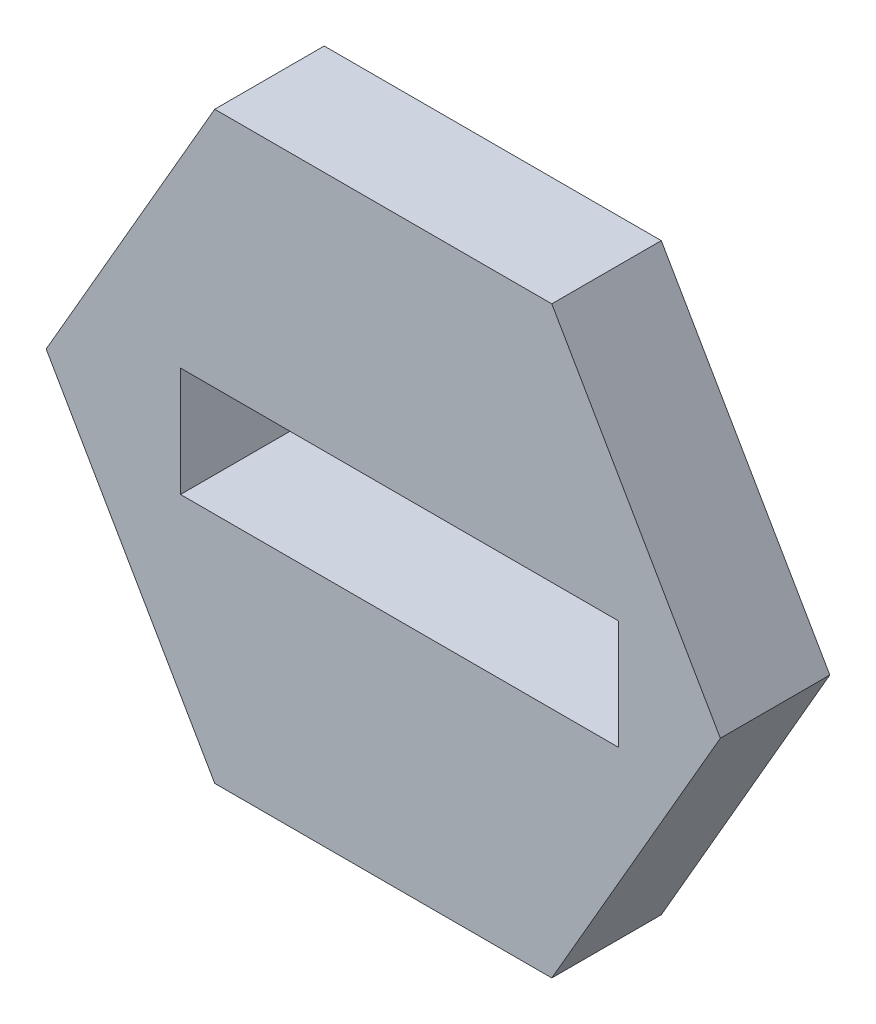
ISO-10303-21;
HEADER;
FILE_DESCRIPTION(('STEP AP214'),'2;1');
FILE_NAME('part.step','',(''),(''),'','','');
FILE_SCHEMA(('AUTOMOTIVE_DESIGN { 1 0 10303 214 1 1 1 1 }'));
ENDSEC;
DATA;
#1=APPLICATION_CONTEXT('core data for automotive mechanical design processes');
#2=APPLICATION_PROTOCOL_DEFINITION('international standard','automotive_design',2000,#1);
#3=PRODUCT_CONTEXT('',#1,'mechanical');
#4=PRODUCT('Part','Part','',(#3));
#5=PRODUCT_RELATED_PRODUCT_CATEGORY('part','',(#4));
#6=PRODUCT_DEFINITION_FORMATION('','',#4);
#7=PRODUCT_DEFINITION_CONTEXT('part definition',#1,'design');
#8=PRODUCT_DEFINITION('design','',#6,#7);
#9=PRODUCT_DEFINITION_SHAPE('','',#8);
#10=(LENGTH_UNIT() NAMED_UNIT(*) SI_UNIT(.MILLI.,.METRE.));
#11=(NAMED_UNIT(*) PLANE_ANGLE_UNIT() SI_UNIT($,.RADIAN.));
#12=(NAMED_UNIT(*) SI_UNIT($,.STERADIAN.) SOLID_ANGLE_UNIT());
#13=UNCERTAINTY_MEASURE_WITH_UNIT(LENGTH_MEASURE(1.E-05),#10,'distance_accuracy_value','');
#14=(GEOMETRIC_REPRESENTATION_CONTEXT(3) GLOBAL_UNCERTAINTY_ASSIGNED_CONTEXT((#13)) GLOBAL_UNIT_ASSIGNED_CONTEXT((#10,
#11,#12)) REPRESENTATION_CONTEXT('',''));
#15=CARTESIAN_POINT('',(0.,0.,0.));
#16=DIRECTION('',(0.,0.,1.));
#17=DIRECTION('',(1.,0.,0.));
#18=AXIS2_PLACEMENT_3D('',#15,#16,#17);
#19=CARTESIAN_POINT('',(-5.38390539742969,13.6932075305893,3.));
#20=DIRECTION('',(0.,0.,1.));
#21=DIRECTION('',(1.,0.,0.));
#22=AXIS2_PLACEMENT_3D('',#19,#20,#21);
#23=PLANE('',#22);
#24=DIRECTION('',(0.499999999999996,0.866025403784442,0.));
#25=VECTOR('',#24,1.);
#26=CARTESIAN_POINT('',(-14.619662063706,-2.30359226174444,3.00000000000001));
#27=LINE('',#26,#25);
#28=CARTESIAN_POINT('',(-14.619662063706,-2.30359226174444,3.00000000000001));
#29=VERTEX_POINT('',#28);
#30=CARTESIAN_POINT('',(-10.0017837305679,5.69480763442236,3.00000000000002));
#31=VERTEX_POINT('',#30);
#32=EDGE_CURVE('E157',#29,#31,#27,.T.);
#33=ORIENTED_EDGE('',*,*,#32,.T.);
#34=DIRECTION('',(-0.500000000000001,0.866025403784439,0.));
#35=VECTOR('',#34,1.);
#36=CARTESIAN_POINT('',(-10.0017837305679,5.69480763442236,3.00000000000002));
#37=LINE('',#36,#35);
#38=CARTESIAN_POINT('',(-14.6196620637061,13.6932075305892,3.00000000000002));
#39=VERTEX_POINT('',#38);
#40=EDGE_CURVE('E160',#31,#39,#37,.T.);
#41=ORIENTED_EDGE('',*,*,#40,.T.);
#42=DIRECTION('',(-1.,0.,0.));
#43=VECTOR('',#42,1.);
#44=CARTESIAN_POINT('',(-14.6196620637061,13.6932075305892,3.00000000000002));
#45=LINE('',#44,#43);
#46=CARTESIAN_POINT('',(-23.8554187299826,13.6932075305892,3.));
#47=VERTEX_POINT('',#46);
#48=EDGE_CURVE('E162',#39,#47,#45,.T.);
#49=ORIENTED_EDGE('',*,*,#48,.T.);
#50=DIRECTION('',(-0.499999999999996,-0.866025403784443,0.));
#51=VECTOR('',#50,1.);
#52=CARTESIAN_POINT('',(-23.8554187299826,13.6932075305892,3.));
#53=LINE('',#52,#51);
#54=CARTESIAN_POINT('',(-28.4732970631208,5.6948076344223,3.00000000000001));
#55=VERTEX_POINT('',#54);
#56=EDGE_CURVE('E164',#47,#55,#53,.T.);
#57=ORIENTED_EDGE('',*,*,#56,.T.);
#58=DIRECTION('',(0.500000000000007,-0.866025403784436,0.));
#59=VECTOR('',#58,1.);
#60=CARTESIAN_POINT('',(-28.4732970631208,5.6948076344223,3.00000000000001));
#61=LINE('',#60,#59);
#62=CARTESIAN_POINT('',(-23.8554187299825,-2.30359226174456,3.00000000000002));
#63=VERTEX_POINT('',#62);
#64=EDGE_CURVE('E166',#55,#63,#61,.T.);
#65=ORIENTED_EDGE('',*,*,#64,.T.);
#66=DIRECTION('',(1.,0.,0.));
#67=VECTOR('',#66,1.);
#68=CARTESIAN_POINT('',(-23.8554187299825,-2.30359226174456,3.00000000000002));
#69=LINE('',#68,#67);
#70=EDGE_CURVE('E168',#63,#29,#69,.T.);
#71=ORIENTED_EDGE('',*,*,#70,.T.);
#72=EDGE_LOOP('',(#33,#41,#49,#57,#65,#71));
#73=FACE_BOUND('',#72,.T.);
#74=DIRECTION('',(1.,0.,0.));
#75=VECTOR('',#74,1.);
#76=CARTESIAN_POINT('',(-24.7918309859156,4.08338028169017,3.));
#77=LINE('',#76,#75);
#78=CARTESIAN_POINT('',(-24.7918309859156,4.08338028169017,3.));
#79=VERTEX_POINT('',#78);
#80=CARTESIAN_POINT('',(-12.7918309859155,4.08338028169017,3.00000000000002));
#81=VERTEX_POINT('',#80);
#82=EDGE_CURVE('E135',#79,#81,#77,.T.);
#83=ORIENTED_EDGE('',*,*,#82,.F.);
#84=DIRECTION('',(0.,-1.,0.));
#85=VECTOR('',#84,1.);
#86=CARTESIAN_POINT('',(-24.7918309859155,7.08338028169014,3.00000000000001));
#87=LINE('',#86,#85);
#88=CARTESIAN_POINT('',(-24.7918309859155,7.08338028169014,3.00000000000001));
#89=VERTEX_POINT('',#88);
#90=EDGE_CURVE('E124',#89,#79,#87,.T.);
#91=ORIENTED_EDGE('',*,*,#90,.F.);
#92=DIRECTION('',(-1.,0.,0.));
#93=VECTOR('',#92,1.);
#94=CARTESIAN_POINT('',(-24.7918309859155,7.08338028169014,3.00000000000001));
#95=LINE('',#94,#93);
#96=CARTESIAN_POINT('',(-12.7918309859155,7.08338028169016,3.00000000000001));
#97=VERTEX_POINT('',#96);
#98=EDGE_CURVE('E139',#97,#89,#95,.T.);
#99=ORIENTED_EDGE('',*,*,#98,.F.);
#100=DIRECTION('',(0.,1.,0.));
#101=VECTOR('',#100,1.);
#102=CARTESIAN_POINT('',(-12.7918309859155,7.08338028169016,3.00000000000001));
#103=LINE('',#102,#101);
#104=EDGE_CURVE('E137',#81,#97,#103,.T.);
#105=ORIENTED_EDGE('',*,*,#104,.F.);
#106=EDGE_LOOP('',(#83,#91,#99,#105));
#107=FACE_BOUND('',#106,.T.);
#108=ADVANCED_FACE('F32',(#73,#107),#23,.T.);
#109=CARTESIAN_POINT('',(-5.38390539742972,13.6932075305893,0.));
#110=DIRECTION('',(0.,0.,1.));
#111=DIRECTION('',(1.,0.,0.));
#112=AXIS2_PLACEMENT_3D('',#109,#110,#111);
#113=PLANE('',#112);
#114=DIRECTION('',(0.499999999999996,0.866025403784442,0.));
#115=VECTOR('',#114,1.);
#116=CARTESIAN_POINT('',(-14.619662063706,-2.30359226174447,0.));
#117=LINE('',#116,#115);
#118=CARTESIAN_POINT('',(-14.619662063706,-2.30359226174447,0.));
#119=VERTEX_POINT('',#118);
#120=CARTESIAN_POINT('',(-10.0017837305679,5.69480763442236,0.));
#121=VERTEX_POINT('',#120);
#122=EDGE_CURVE('E125',#119,#121,#117,.T.);
#123=ORIENTED_EDGE('',*,*,#122,.F.);
#124=DIRECTION('',(1.,0.,0.));
#125=VECTOR('',#124,1.);
#126=CARTESIAN_POINT('',(-23.8554187299825,-2.30359226174452,0.));
#127=LINE('',#126,#125);
#128=CARTESIAN_POINT('',(-23.8554187299825,-2.30359226174452,0.));
#129=VERTEX_POINT('',#128);
#130=EDGE_CURVE('E155',#129,#119,#127,.T.);
#131=ORIENTED_EDGE('',*,*,#130,.F.);
#132=DIRECTION('',(0.500000000000007,-0.866025403784436,0.));
#133=VECTOR('',#132,1.);
#134=CARTESIAN_POINT('',(-28.4732970631207,5.69480763442231,0.));
#135=LINE('',#134,#133);
#136=CARTESIAN_POINT('',(-28.4732970631207,5.69480763442231,0.));
#137=VERTEX_POINT('',#136);
#138=EDGE_CURVE('E153',#137,#129,#135,.T.);
#139=ORIENTED_EDGE('',*,*,#138,.F.);
#140=DIRECTION('',(-0.499999999999996,-0.866025403784443,0.));
#141=VECTOR('',#140,1.);
#142=CARTESIAN_POINT('',(-23.8554187299826,13.6932075305892,0.));
#143=LINE('',#142,#141);
#144=CARTESIAN_POINT('',(-23.8554187299826,13.6932075305892,0.));
#145=VERTEX_POINT('',#144);
#146=EDGE_CURVE('E151',#145,#137,#143,.T.);
#147=ORIENTED_EDGE('',*,*,#146,.F.);
#148=DIRECTION('',(-1.,0.,0.));
#149=VECTOR('',#148,1.);
#150=CARTESIAN_POINT('',(-14.6196620637061,13.6932075305892,0.));
#151=LINE('',#150,#149);
#152=CARTESIAN_POINT('',(-14.6196620637061,13.6932075305892,0.));
#153=VERTEX_POINT('',#152);
#154=EDGE_CURVE('E149',#153,#145,#151,.T.);
#155=ORIENTED_EDGE('',*,*,#154,.F.);
#156=DIRECTION('',(-0.500000000000001,0.866025403784439,0.));
#157=VECTOR('',#156,1.);
#158=CARTESIAN_POINT('',(-10.0017837305679,5.69480763442236,0.));
#159=LINE('',#158,#157);
#160=EDGE_CURVE('E147',#121,#153,#159,.T.);
#161=ORIENTED_EDGE('',*,*,#160,.F.);
#162=EDGE_LOOP('',(#123,#131,#139,#147,#155,#161));
#163=FACE_BOUND('',#162,.T.);
#164=DIRECTION('',(0.,-1.,0.));
#165=VECTOR('',#164,1.);
#166=CARTESIAN_POINT('',(-24.7918309859156,7.08338028169016,0.));
#167=LINE('',#166,#165);
#168=CARTESIAN_POINT('',(-24.7918309859156,7.08338028169016,0.));
#169=VERTEX_POINT('',#168);
#170=CARTESIAN_POINT('',(-24.7918309859156,4.08338028169015,0.));
#171=VERTEX_POINT('',#170);
#172=EDGE_CURVE('E55',#169,#171,#167,.T.);
#173=ORIENTED_EDGE('',*,*,#172,.T.);
#174=DIRECTION('',(1.,0.,0.));
#175=VECTOR('',#174,1.);
#176=CARTESIAN_POINT('',(-24.7918309859156,4.08338028169015,0.));
#177=LINE('',#176,#175);
#178=CARTESIAN_POINT('',(-12.7918309859156,4.08338028169016,0.));
#179=VERTEX_POINT('',#178);
#180=EDGE_CURVE('E111',#171,#179,#177,.T.);
#181=ORIENTED_EDGE('',*,*,#180,.T.);
#182=DIRECTION('',(0.,1.,0.));
#183=VECTOR('',#182,1.);
#184=CARTESIAN_POINT('',(-12.7918309859155,7.08338028169015,0.));
#185=LINE('',#184,#183);
#186=CARTESIAN_POINT('',(-12.7918309859155,7.08338028169015,0.));
#187=VERTEX_POINT('',#186);
#188=EDGE_CURVE('E120',#179,#187,#185,.T.);
#189=ORIENTED_EDGE('',*,*,#188,.T.);
#190=DIRECTION('',(-1.,0.,0.));
#191=VECTOR('',#190,1.);
#192=CARTESIAN_POINT('',(-24.7918309859156,7.08338028169016,0.));
#193=LINE('',#192,#191);
#194=EDGE_CURVE('E129',#187,#169,#193,.T.);
#195=ORIENTED_EDGE('',*,*,#194,.T.);
#196=EDGE_LOOP('',(#173,#181,#189,#195));
#197=FACE_BOUND('',#196,.T.);
#198=ADVANCED_FACE('F128',(#163,#197),#113,.F.);
#199=CARTESIAN_POINT('',(-14.619662063706,-2.30359226174444,3.00000000000001));
#200=DIRECTION('',(-0.866025403784442,0.499999999999995,0.));
#201=DIRECTION('',(-0.499999999999996,-0.866025403784443,0.));
#202=AXIS2_PLACEMENT_3D('',#199,#200,#201);
#203=PLANE('',#202);
#204=ORIENTED_EDGE('',*,*,#122,.T.);
#205=DIRECTION('',(0.,0.,-1.));
#206=VECTOR('',#205,1.);
#207=CARTESIAN_POINT('',(-10.0017837305679,5.69480763442236,3.00000000000002));
#208=LINE('',#207,#206);
#209=EDGE_CURVE('E11',#31,#121,#208,.T.);
#210=ORIENTED_EDGE('',*,*,#209,.F.);
#211=ORIENTED_EDGE('',*,*,#32,.F.);
#212=DIRECTION('',(0.,0.,-1.));
#213=VECTOR('',#212,1.);
#214=CARTESIAN_POINT('',(-14.619662063706,-2.30359226174444,3.00000000000001));
#215=LINE('',#214,#213);
#216=EDGE_CURVE('E170',#29,#119,#215,.T.);
#217=ORIENTED_EDGE('',*,*,#216,.T.);
#218=EDGE_LOOP('',(#204,#210,#211,#217));
#219=FACE_BOUND('',#218,.T.);
#220=ADVANCED_FACE('F34',(#219),#203,.F.);
#221=CARTESIAN_POINT('',(-10.0017837305679,5.69480763442236,3.00000000000002));
#222=DIRECTION('',(-0.866025403784439,-0.500000000000002,0.));
#223=DIRECTION('',(0.500000000000001,-0.866025403784439,0.));
#224=AXIS2_PLACEMENT_3D('',#221,#222,#223);
#225=PLANE('',#224);
#226=ORIENTED_EDGE('',*,*,#160,.T.);
#227=DIRECTION('',(0.,0.,-1.));
#228=VECTOR('',#227,1.);
#229=CARTESIAN_POINT('',(-14.6196620637061,13.6932075305892,3.00000000000002));
#230=LINE('',#229,#228);
#231=EDGE_CURVE('E40',#39,#153,#230,.T.);
#232=ORIENTED_EDGE('',*,*,#231,.F.);
#233=ORIENTED_EDGE('',*,*,#40,.F.);
#234=ORIENTED_EDGE('',*,*,#209,.T.);
#235=EDGE_LOOP('',(#226,#232,#233,#234));
#236=FACE_BOUND('',#235,.T.);
#237=ADVANCED_FACE('F208',(#236),#225,.F.);
#238=CARTESIAN_POINT('',(-14.6196620637061,13.6932075305892,3.00000000000002));
#239=DIRECTION('',(0.,-1.,0.));
#240=DIRECTION('',(1.,0.,0.));
#241=AXIS2_PLACEMENT_3D('',#238,#239,#240);
#242=PLANE('',#241);
#243=ORIENTED_EDGE('',*,*,#154,.T.);
#244=DIRECTION('',(0.,0.,-1.));
#245=VECTOR('',#244,1.);
#246=CARTESIAN_POINT('',(-23.8554187299826,13.6932075305892,3.));
#247=LINE('',#246,#245);
#248=EDGE_CURVE('E179',#47,#145,#247,.T.);
#249=ORIENTED_EDGE('',*,*,#248,.F.);
#250=ORIENTED_EDGE('',*,*,#48,.F.);
#251=ORIENTED_EDGE('',*,*,#231,.T.);
#252=EDGE_LOOP('',(#243,#249,#250,#251));
#253=FACE_BOUND('',#252,.T.);
#254=ADVANCED_FACE('F186',(#253),#242,.F.);
#255=CARTESIAN_POINT('',(-23.8554187299826,13.6932075305892,3.));
#256=DIRECTION('',(0.866025403784443,-0.499999999999996,0.));
#257=DIRECTION('',(0.499999999999996,0.866025403784442,0.));
#258=AXIS2_PLACEMENT_3D('',#255,#256,#257);
#259=PLANE('',#258);
#260=ORIENTED_EDGE('',*,*,#146,.T.);
#261=DIRECTION('',(0.,0.,-1.));
#262=VECTOR('',#261,1.);
#263=CARTESIAN_POINT('',(-28.4732970631208,5.6948076344223,3.00000000000001));
#264=LINE('',#263,#262);
#265=EDGE_CURVE('E176',#55,#137,#264,.T.);
#266=ORIENTED_EDGE('',*,*,#265,.F.);
#267=ORIENTED_EDGE('',*,*,#56,.F.);
#268=ORIENTED_EDGE('',*,*,#248,.T.);
#269=EDGE_LOOP('',(#260,#266,#267,#268));
#270=FACE_BOUND('',#269,.T.);
#271=ADVANCED_FACE('F196',(#270),#259,.F.);
#272=CARTESIAN_POINT('',(-28.4732970631208,5.6948076344223,3.00000000000001));
#273=DIRECTION('',(0.866025403784436,0.500000000000008,0.));
#274=DIRECTION('',(-0.500000000000008,0.866025403784435,0.));
#275=AXIS2_PLACEMENT_3D('',#272,#273,#274);
#276=PLANE('',#275);
#277=ORIENTED_EDGE('',*,*,#138,.T.);
#278=DIRECTION('',(0.,0.,-1.));
#279=VECTOR('',#278,1.);
#280=CARTESIAN_POINT('',(-23.8554187299825,-2.30359226174456,3.00000000000002));
#281=LINE('',#280,#279);
#282=EDGE_CURVE('E173',#63,#129,#281,.T.);
#283=ORIENTED_EDGE('',*,*,#282,.F.);
#284=ORIENTED_EDGE('',*,*,#64,.F.);
#285=ORIENTED_EDGE('',*,*,#265,.T.);
#286=EDGE_LOOP('',(#277,#283,#284,#285));
#287=FACE_BOUND('',#286,.T.);
#288=ADVANCED_FACE('F200',(#287),#276,.F.);
#289=CARTESIAN_POINT('',(-23.8554187299825,-2.30359226174456,3.00000000000002));
#290=DIRECTION('',(0.,1.,0.));
#291=DIRECTION('',(-1.,0.,0.));
#292=AXIS2_PLACEMENT_3D('',#289,#290,#291);
#293=PLANE('',#292);
#294=ORIENTED_EDGE('',*,*,#130,.T.);
#295=ORIENTED_EDGE('',*,*,#216,.F.);
#296=ORIENTED_EDGE('',*,*,#70,.F.);
#297=ORIENTED_EDGE('',*,*,#282,.T.);
#298=EDGE_LOOP('',(#294,#295,#296,#297));
#299=FACE_BOUND('',#298,.T.);
#300=ADVANCED_FACE('F211',(#299),#293,.F.);
#301=CARTESIAN_POINT('',(-24.7918309859155,7.08338028169014,3.00000000000001));
#302=DIRECTION('',(1.,0.,0.));
#303=DIRECTION('',(0.,1.,0.));
#304=AXIS2_PLACEMENT_3D('',#301,#302,#303);
#305=PLANE('',#304);
#306=ORIENTED_EDGE('',*,*,#172,.F.);
#307=DIRECTION('',(0.,0.,-1.));
#308=VECTOR('',#307,1.);
#309=CARTESIAN_POINT('',(-24.7918309859155,7.08338028169014,3.00000000000001));
#310=LINE('',#309,#308);
#311=EDGE_CURVE('E141',#89,#169,#310,.T.);
#312=ORIENTED_EDGE('',*,*,#311,.F.);
#313=ORIENTED_EDGE('',*,*,#90,.T.);
#314=DIRECTION('',(0.,0.,-1.));
#315=VECTOR('',#314,1.);
#316=CARTESIAN_POINT('',(-24.7918309859156,4.08338028169017,3.));
#317=LINE('',#316,#315);
#318=EDGE_CURVE('E113',#79,#171,#317,.T.);
#319=ORIENTED_EDGE('',*,*,#318,.T.);
#320=EDGE_LOOP('',(#306,#312,#313,#319));
#321=FACE_BOUND('',#320,.T.);
#322=ADVANCED_FACE('F122',(#321),#305,.T.);
#323=CARTESIAN_POINT('',(-24.7918309859156,4.08338028169017,3.));
#324=DIRECTION('',(0.,1.,0.));
#325=DIRECTION('',(0.,0.,1.));
#326=AXIS2_PLACEMENT_3D('',#323,#324,#325);
#327=PLANE('',#326);
#328=ORIENTED_EDGE('',*,*,#180,.F.);
#329=ORIENTED_EDGE('',*,*,#318,.F.);
#330=ORIENTED_EDGE('',*,*,#82,.T.);
#331=DIRECTION('',(0.,0.,-1.));
#332=VECTOR('',#331,1.);
#333=CARTESIAN_POINT('',(-12.7918309859155,4.08338028169017,3.00000000000002));
#334=LINE('',#333,#332);
#335=EDGE_CURVE('E116',#81,#179,#334,.T.);
#336=ORIENTED_EDGE('',*,*,#335,.T.);
#337=EDGE_LOOP('',(#328,#329,#330,#336));
#338=FACE_BOUND('',#337,.T.);
#339=ADVANCED_FACE('F112',(#338),#327,.T.);
#340=CARTESIAN_POINT('',(-12.7918309859155,7.08338028169016,3.00000000000001));
#341=DIRECTION('',(-1.,0.,0.));
#342=DIRECTION('',(0.,0.,1.));
#343=AXIS2_PLACEMENT_3D('',#340,#341,#342);
#344=PLANE('',#343);
#345=ORIENTED_EDGE('',*,*,#188,.F.);
#346=ORIENTED_EDGE('',*,*,#335,.F.);
#347=ORIENTED_EDGE('',*,*,#104,.T.);
#348=DIRECTION('',(0.,0.,-1.));
#349=VECTOR('',#348,1.);
#350=CARTESIAN_POINT('',(-12.7918309859155,7.08338028169016,3.00000000000001));
#351=LINE('',#350,#349);
#352=EDGE_CURVE('E47',#97,#187,#351,.T.);
#353=ORIENTED_EDGE('',*,*,#352,.T.);
#354=EDGE_LOOP('',(#345,#346,#347,#353));
#355=FACE_BOUND('',#354,.T.);
#356=ADVANCED_FACE('F229',(#355),#344,.T.);
#357=CARTESIAN_POINT('',(-24.7918309859155,7.08338028169014,3.00000000000001));
#358=DIRECTION('',(0.,-1.,0.));
#359=DIRECTION('',(0.,0.,-1.));
#360=AXIS2_PLACEMENT_3D('',#357,#358,#359);
#361=PLANE('',#360);
#362=ORIENTED_EDGE('',*,*,#194,.F.);
#363=ORIENTED_EDGE('',*,*,#352,.F.);
#364=ORIENTED_EDGE('',*,*,#98,.T.);
#365=ORIENTED_EDGE('',*,*,#311,.T.);
#366=EDGE_LOOP('',(#362,#363,#364,#365));
#367=FACE_BOUND('',#366,.T.);
#368=ADVANCED_FACE('F232',(#367),#361,.T.);
#369=CLOSED_SHELL('',(#108,#198,#220,#237,#254,#271,#288,#300,#322,#339,#356,#368));
#370=MANIFOLD_SOLID_BREP('B2',#369);
#371=ADVANCED_BREP_SHAPE_REPRESENTATION('',(#18,#370),#14);
#372=SHAPE_DEFINITION_REPRESENTATION(#9,#371);
ENDSEC;
END-ISO-10303-21;
